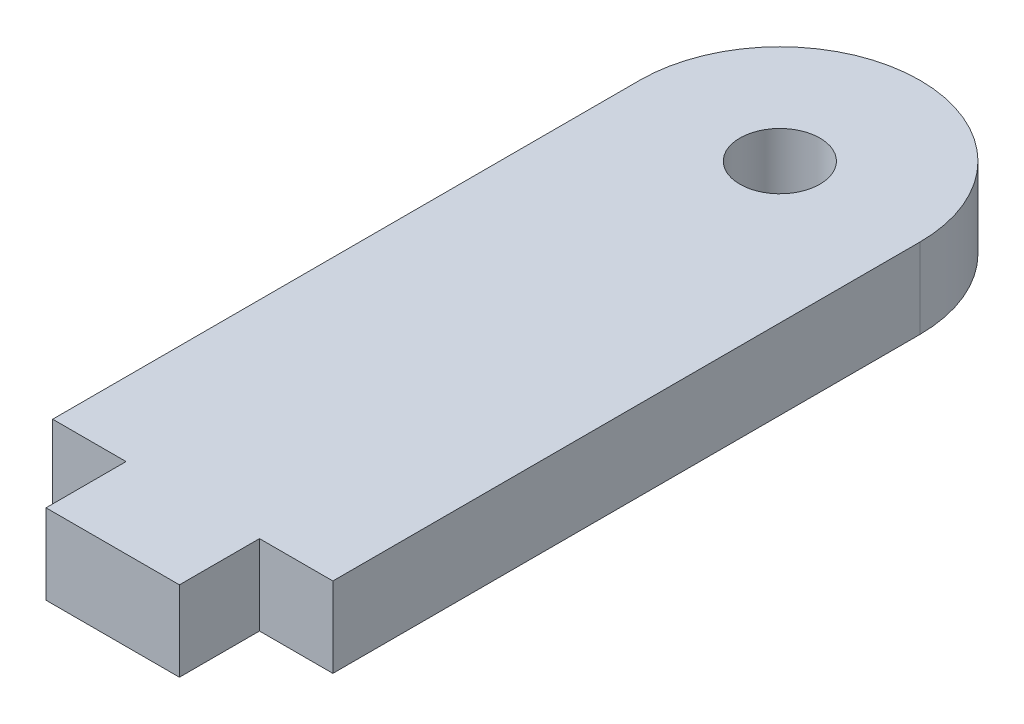
ISO-10303-21;
HEADER;
FILE_DESCRIPTION(('STEP AP214'),'2;1');
FILE_NAME('part.step','',(''),(''),'','','');
FILE_SCHEMA(('AUTOMOTIVE_DESIGN { 1 0 10303 214 1 1 1 1 }'));
ENDSEC;
DATA;
#1=APPLICATION_CONTEXT('core data for automotive mechanical design processes');
#2=APPLICATION_PROTOCOL_DEFINITION('international standard','automotive_design',2000,#1);
#3=PRODUCT_CONTEXT('',#1,'mechanical');
#4=PRODUCT('Part','Part','',(#3));
#5=PRODUCT_RELATED_PRODUCT_CATEGORY('part','',(#4));
#6=PRODUCT_DEFINITION_FORMATION('','',#4);
#7=PRODUCT_DEFINITION_CONTEXT('part definition',#1,'design');
#8=PRODUCT_DEFINITION('design','',#6,#7);
#9=PRODUCT_DEFINITION_SHAPE('','',#8);
#10=(LENGTH_UNIT() NAMED_UNIT(*) SI_UNIT(.MILLI.,.METRE.));
#11=(NAMED_UNIT(*) PLANE_ANGLE_UNIT() SI_UNIT($,.RADIAN.));
#12=(NAMED_UNIT(*) SI_UNIT($,.STERADIAN.) SOLID_ANGLE_UNIT());
#13=UNCERTAINTY_MEASURE_WITH_UNIT(LENGTH_MEASURE(1.E-05),#10,'distance_accuracy_value','');
#14=(GEOMETRIC_REPRESENTATION_CONTEXT(3) GLOBAL_UNCERTAINTY_ASSIGNED_CONTEXT((#13)) GLOBAL_UNIT_ASSIGNED_CONTEXT((#10,
#11,#12)) REPRESENTATION_CONTEXT('',''));
#15=CARTESIAN_POINT('',(0.,0.,0.));
#16=DIRECTION('',(0.,0.,1.));
#17=DIRECTION('',(1.,0.,0.));
#18=AXIS2_PLACEMENT_3D('',#15,#16,#17);
#19=CARTESIAN_POINT('',(10.5,3.,0.));
#20=DIRECTION('',(1.,0.,0.));
#21=DIRECTION('',(0.,0.,-1.));
#22=AXIS2_PLACEMENT_3D('',#19,#20,#21);
#23=PLANE('',#22);
#24=DIRECTION('',(0.,0.,1.));
#25=VECTOR('',#24,1.);
#26=CARTESIAN_POINT('',(10.5,0.,0.));
#27=LINE('',#26,#25);
#28=CARTESIAN_POINT('',(10.5,0.,0.));
#29=VERTEX_POINT('',#28);
#30=CARTESIAN_POINT('',(10.5,0.,22.));
#31=VERTEX_POINT('',#30);
#32=EDGE_CURVE('E149',#29,#31,#27,.T.);
#33=ORIENTED_EDGE('',*,*,#32,.F.);
#34=DIRECTION('',(0.,-1.,0.));
#35=VECTOR('',#34,1.);
#36=CARTESIAN_POINT('',(10.5,3.,0.));
#37=LINE('',#36,#35);
#38=CARTESIAN_POINT('',(10.5,3.,0.));
#39=VERTEX_POINT('',#38);
#40=EDGE_CURVE('E11',#39,#29,#37,.T.);
#41=ORIENTED_EDGE('',*,*,#40,.F.);
#42=DIRECTION('',(0.,0.,1.));
#43=VECTOR('',#42,1.);
#44=CARTESIAN_POINT('',(10.5,3.,0.));
#45=LINE('',#44,#43);
#46=CARTESIAN_POINT('',(10.5,3.,22.));
#47=VERTEX_POINT('',#46);
#48=EDGE_CURVE('E234',#39,#47,#45,.T.);
#49=ORIENTED_EDGE('',*,*,#48,.T.);
#50=DIRECTION('',(0.,-1.,0.));
#51=VECTOR('',#50,1.);
#52=CARTESIAN_POINT('',(10.5,3.,22.));
#53=LINE('',#52,#51);
#54=EDGE_CURVE('E97',#47,#31,#53,.T.);
#55=ORIENTED_EDGE('',*,*,#54,.T.);
#56=EDGE_LOOP('',(#33,#41,#49,#55));
#57=FACE_BOUND('',#56,.T.);
#58=ADVANCED_FACE('F45',(#57),#23,.T.);
#59=CARTESIAN_POINT('',(5.25,3.,0.));
#60=DIRECTION('',(0.,-1.,0.));
#61=DIRECTION('',(0.,0.,-1.));
#62=AXIS2_PLACEMENT_3D('',#59,#60,#61);
#63=CYLINDRICAL_SURFACE('',#62,5.25);
#64=CARTESIAN_POINT('',(5.25,0.,0.));
#65=DIRECTION('',(0.,1.,0.));
#66=DIRECTION('',(0.,0.,1.));
#67=AXIS2_PLACEMENT_3D('',#64,#65,#66);
#68=CIRCLE('',#67,5.25);
#69=CARTESIAN_POINT('',(0.,0.,0.));
#70=VERTEX_POINT('',#69);
#71=EDGE_CURVE('E153',#29,#70,#68,.T.);
#72=ORIENTED_EDGE('',*,*,#71,.T.);
#73=DIRECTION('',(0.,-1.,0.));
#74=VECTOR('',#73,1.);
#75=CARTESIAN_POINT('',(0.,3.,0.));
#76=LINE('',#75,#74);
#77=CARTESIAN_POINT('',(0.,3.,0.));
#78=VERTEX_POINT('',#77);
#79=EDGE_CURVE('E55',#78,#70,#76,.T.);
#80=ORIENTED_EDGE('',*,*,#79,.F.);
#81=CARTESIAN_POINT('',(5.25,3.,0.));
#82=DIRECTION('',(0.,1.,0.));
#83=DIRECTION('',(0.,0.,1.));
#84=AXIS2_PLACEMENT_3D('',#81,#82,#83);
#85=CIRCLE('',#84,5.25);
#86=EDGE_CURVE('E238',#39,#78,#85,.T.);
#87=ORIENTED_EDGE('',*,*,#86,.F.);
#88=ORIENTED_EDGE('',*,*,#40,.T.);
#89=EDGE_LOOP('',(#72,#80,#87,#88));
#90=FACE_BOUND('',#89,.T.);
#91=ADVANCED_FACE('F199',(#90),#63,.T.);
#92=CARTESIAN_POINT('',(0.,3.,0.));
#93=DIRECTION('',(1.,0.,0.));
#94=DIRECTION('',(0.,0.,-1.));
#95=AXIS2_PLACEMENT_3D('',#92,#93,#94);
#96=PLANE('',#95);
#97=DIRECTION('',(0.,0.,1.));
#98=VECTOR('',#97,1.);
#99=CARTESIAN_POINT('',(0.,0.,0.));
#100=LINE('',#99,#98);
#101=CARTESIAN_POINT('',(0.,0.,22.));
#102=VERTEX_POINT('',#101);
#103=EDGE_CURVE('E157',#70,#102,#100,.T.);
#104=ORIENTED_EDGE('',*,*,#103,.T.);
#105=DIRECTION('',(0.,-1.,0.));
#106=VECTOR('',#105,1.);
#107=CARTESIAN_POINT('',(0.,3.,22.));
#108=LINE('',#107,#106);
#109=CARTESIAN_POINT('',(0.,3.,22.));
#110=VERTEX_POINT('',#109);
#111=EDGE_CURVE('E185',#110,#102,#108,.T.);
#112=ORIENTED_EDGE('',*,*,#111,.F.);
#113=DIRECTION('',(0.,0.,1.));
#114=VECTOR('',#113,1.);
#115=CARTESIAN_POINT('',(0.,3.,0.));
#116=LINE('',#115,#114);
#117=EDGE_CURVE('E195',#78,#110,#116,.T.);
#118=ORIENTED_EDGE('',*,*,#117,.F.);
#119=ORIENTED_EDGE('',*,*,#79,.T.);
#120=EDGE_LOOP('',(#104,#112,#118,#119));
#121=FACE_BOUND('',#120,.T.);
#122=ADVANCED_FACE('F192',(#121),#96,.F.);
#123=CARTESIAN_POINT('',(0.,3.,22.));
#124=DIRECTION('',(0.,0.,-1.));
#125=DIRECTION('',(-1.,0.,0.));
#126=AXIS2_PLACEMENT_3D('',#123,#124,#125);
#127=PLANE('',#126);
#128=DIRECTION('',(1.,0.,0.));
#129=VECTOR('',#128,1.);
#130=CARTESIAN_POINT('',(0.,0.,22.));
#131=LINE('',#130,#129);
#132=CARTESIAN_POINT('',(2.75,0.,22.));
#133=VERTEX_POINT('',#132);
#134=EDGE_CURVE('E161',#102,#133,#131,.T.);
#135=ORIENTED_EDGE('',*,*,#134,.T.);
#136=DIRECTION('',(0.,-1.,0.));
#137=VECTOR('',#136,1.);
#138=CARTESIAN_POINT('',(2.75,3.,22.));
#139=LINE('',#138,#137);
#140=CARTESIAN_POINT('',(2.75,3.,22.));
#141=VERTEX_POINT('',#140);
#142=EDGE_CURVE('E181',#141,#133,#139,.T.);
#143=ORIENTED_EDGE('',*,*,#142,.F.);
#144=DIRECTION('',(1.,0.,0.));
#145=VECTOR('',#144,1.);
#146=CARTESIAN_POINT('',(0.,3.,22.));
#147=LINE('',#146,#145);
#148=EDGE_CURVE('E142',#110,#141,#147,.T.);
#149=ORIENTED_EDGE('',*,*,#148,.F.);
#150=ORIENTED_EDGE('',*,*,#111,.T.);
#151=EDGE_LOOP('',(#135,#143,#149,#150));
#152=FACE_BOUND('',#151,.T.);
#153=ADVANCED_FACE('F210',(#152),#127,.F.);
#154=CARTESIAN_POINT('',(2.75,3.,0.));
#155=DIRECTION('',(1.,0.,0.));
#156=DIRECTION('',(0.,0.,-1.));
#157=AXIS2_PLACEMENT_3D('',#154,#155,#156);
#158=PLANE('',#157);
#159=DIRECTION('',(0.,0.,1.));
#160=VECTOR('',#159,1.);
#161=CARTESIAN_POINT('',(2.75,0.,0.));
#162=LINE('',#161,#160);
#163=CARTESIAN_POINT('',(2.75,0.,25.));
#164=VERTEX_POINT('',#163);
#165=EDGE_CURVE('E165',#133,#164,#162,.T.);
#166=ORIENTED_EDGE('',*,*,#165,.T.);
#167=DIRECTION('',(0.,-1.,0.));
#168=VECTOR('',#167,1.);
#169=CARTESIAN_POINT('',(2.75,3.,25.));
#170=LINE('',#169,#168);
#171=CARTESIAN_POINT('',(2.75,3.,25.));
#172=VERTEX_POINT('',#171);
#173=EDGE_CURVE('E135',#172,#164,#170,.T.);
#174=ORIENTED_EDGE('',*,*,#173,.F.);
#175=DIRECTION('',(0.,0.,1.));
#176=VECTOR('',#175,1.);
#177=CARTESIAN_POINT('',(2.75,3.,0.));
#178=LINE('',#177,#176);
#179=EDGE_CURVE('E121',#141,#172,#178,.T.);
#180=ORIENTED_EDGE('',*,*,#179,.F.);
#181=ORIENTED_EDGE('',*,*,#142,.T.);
#182=EDGE_LOOP('',(#166,#174,#180,#181));
#183=FACE_BOUND('',#182,.T.);
#184=ADVANCED_FACE('F211',(#183),#158,.F.);
#185=CARTESIAN_POINT('',(0.,3.,25.));
#186=DIRECTION('',(0.,0.,-1.));
#187=DIRECTION('',(-1.,0.,0.));
#188=AXIS2_PLACEMENT_3D('',#185,#186,#187);
#189=PLANE('',#188);
#190=DIRECTION('',(1.,0.,0.));
#191=VECTOR('',#190,1.);
#192=CARTESIAN_POINT('',(0.,0.,25.));
#193=LINE('',#192,#191);
#194=CARTESIAN_POINT('',(7.75,0.,25.));
#195=VERTEX_POINT('',#194);
#196=EDGE_CURVE('E130',#164,#195,#193,.T.);
#197=ORIENTED_EDGE('',*,*,#196,.T.);
#198=DIRECTION('',(0.,-1.,0.));
#199=VECTOR('',#198,1.);
#200=CARTESIAN_POINT('',(7.75,3.,25.));
#201=LINE('',#200,#199);
#202=CARTESIAN_POINT('',(7.75,3.,25.));
#203=VERTEX_POINT('',#202);
#204=EDGE_CURVE('E128',#203,#195,#201,.T.);
#205=ORIENTED_EDGE('',*,*,#204,.F.);
#206=DIRECTION('',(1.,0.,0.));
#207=VECTOR('',#206,1.);
#208=CARTESIAN_POINT('',(0.,3.,25.));
#209=LINE('',#208,#207);
#210=EDGE_CURVE('E115',#172,#203,#209,.T.);
#211=ORIENTED_EDGE('',*,*,#210,.F.);
#212=ORIENTED_EDGE('',*,*,#173,.T.);
#213=EDGE_LOOP('',(#197,#205,#211,#212));
#214=FACE_BOUND('',#213,.T.);
#215=ADVANCED_FACE('F129',(#214),#189,.F.);
#216=CARTESIAN_POINT('',(7.75000000000001,3.,0.));
#217=DIRECTION('',(1.,0.,0.));
#218=DIRECTION('',(0.,0.,-1.));
#219=AXIS2_PLACEMENT_3D('',#216,#217,#218);
#220=PLANE('',#219);
#221=DIRECTION('',(0.,0.,1.));
#222=VECTOR('',#221,1.);
#223=CARTESIAN_POINT('',(7.75000000000001,0.,0.));
#224=LINE('',#223,#222);
#225=CARTESIAN_POINT('',(7.75,0.,22.));
#226=VERTEX_POINT('',#225);
#227=EDGE_CURVE('E172',#226,#195,#224,.T.);
#228=ORIENTED_EDGE('',*,*,#227,.F.);
#229=DIRECTION('',(0.,-1.,0.));
#230=VECTOR('',#229,1.);
#231=CARTESIAN_POINT('',(7.75,3.,22.));
#232=LINE('',#231,#230);
#233=CARTESIAN_POINT('',(7.75,3.,22.));
#234=VERTEX_POINT('',#233);
#235=EDGE_CURVE('E90',#234,#226,#232,.T.);
#236=ORIENTED_EDGE('',*,*,#235,.F.);
#237=DIRECTION('',(0.,0.,1.));
#238=VECTOR('',#237,1.);
#239=CARTESIAN_POINT('',(7.75000000000001,3.,0.));
#240=LINE('',#239,#238);
#241=EDGE_CURVE('E119',#234,#203,#240,.T.);
#242=ORIENTED_EDGE('',*,*,#241,.T.);
#243=ORIENTED_EDGE('',*,*,#204,.T.);
#244=EDGE_LOOP('',(#228,#236,#242,#243));
#245=FACE_BOUND('',#244,.T.);
#246=ADVANCED_FACE('F137',(#245),#220,.T.);
#247=CARTESIAN_POINT('',(5.25,3.,0.));
#248=DIRECTION('',(0.,-1.,0.));
#249=DIRECTION('',(0.,0.,-1.));
#250=AXIS2_PLACEMENT_3D('',#247,#248,#249);
#251=CYLINDRICAL_SURFACE('',#250,1.5);
#252=CARTESIAN_POINT('',(5.25,3.,0.));
#253=DIRECTION('',(0.,1.,0.));
#254=DIRECTION('',(0.,0.,1.));
#255=AXIS2_PLACEMENT_3D('',#252,#253,#254);
#256=CIRCLE('',#255,1.5);
#257=CARTESIAN_POINT('',(5.25,3.,1.5));
#258=VERTEX_POINT('',#257);
#259=EDGE_CURVE('E231',#258,#258,#256,.T.);
#260=ORIENTED_EDGE('',*,*,#259,.T.);
#261=EDGE_LOOP('',(#260));
#262=FACE_BOUND('',#261,.T.);
#263=CARTESIAN_POINT('',(5.25,0.,0.));
#264=DIRECTION('',(0.,1.,0.));
#265=DIRECTION('',(0.,0.,1.));
#266=AXIS2_PLACEMENT_3D('',#263,#264,#265);
#267=CIRCLE('',#266,1.5);
#268=CARTESIAN_POINT('',(5.25,0.,1.5));
#269=VERTEX_POINT('',#268);
#270=EDGE_CURVE('E145',#269,#269,#267,.T.);
#271=ORIENTED_EDGE('',*,*,#270,.F.);
#272=EDGE_LOOP('',(#271));
#273=FACE_BOUND('',#272,.T.);
#274=ADVANCED_FACE('F47',(#262,#273),#251,.F.);
#275=EDGE_CURVE('E166',#226,#31,#131,.T.);
#276=ORIENTED_EDGE('',*,*,#275,.T.);
#277=ORIENTED_EDGE('',*,*,#54,.F.);
#278=EDGE_CURVE('E63',#234,#47,#147,.T.);
#279=ORIENTED_EDGE('',*,*,#278,.F.);
#280=ORIENTED_EDGE('',*,*,#235,.T.);
#281=EDGE_LOOP('',(#276,#277,#279,#280));
#282=FACE_BOUND('',#281,.T.);
#283=ADVANCED_FACE('F219',(#282),#127,.F.);
#284=CARTESIAN_POINT('',(0.,3.,0.));
#285=DIRECTION('',(0.,1.,0.));
#286=DIRECTION('',(0.,0.,1.));
#287=AXIS2_PLACEMENT_3D('',#284,#285,#286);
#288=PLANE('',#287);
#289=ORIENTED_EDGE('',*,*,#259,.F.);
#290=EDGE_LOOP('',(#289));
#291=FACE_BOUND('',#290,.T.);
#292=ORIENTED_EDGE('',*,*,#48,.F.);
#293=ORIENTED_EDGE('',*,*,#86,.T.);
#294=ORIENTED_EDGE('',*,*,#117,.T.);
#295=ORIENTED_EDGE('',*,*,#148,.T.);
#296=ORIENTED_EDGE('',*,*,#179,.T.);
#297=ORIENTED_EDGE('',*,*,#210,.T.);
#298=ORIENTED_EDGE('',*,*,#241,.F.);
#299=ORIENTED_EDGE('',*,*,#278,.T.);
#300=EDGE_LOOP('',(#292,#293,#294,#295,#296,#297,#298,#299));
#301=FACE_BOUND('',#300,.T.);
#302=ADVANCED_FACE('F117',(#291,#301),#288,.T.);
#303=CARTESIAN_POINT('',(0.,0.,0.));
#304=DIRECTION('',(0.,1.,0.));
#305=DIRECTION('',(0.,0.,1.));
#306=AXIS2_PLACEMENT_3D('',#303,#304,#305);
#307=PLANE('',#306);
#308=ORIENTED_EDGE('',*,*,#270,.T.);
#309=EDGE_LOOP('',(#308));
#310=FACE_BOUND('',#309,.T.);
#311=ORIENTED_EDGE('',*,*,#32,.T.);
#312=ORIENTED_EDGE('',*,*,#275,.F.);
#313=ORIENTED_EDGE('',*,*,#227,.T.);
#314=ORIENTED_EDGE('',*,*,#196,.F.);
#315=ORIENTED_EDGE('',*,*,#165,.F.);
#316=ORIENTED_EDGE('',*,*,#134,.F.);
#317=ORIENTED_EDGE('',*,*,#103,.F.);
#318=ORIENTED_EDGE('',*,*,#71,.F.);
#319=EDGE_LOOP('',(#311,#312,#313,#314,#315,#316,#317,#318));
#320=FACE_BOUND('',#319,.T.);
#321=ADVANCED_FACE('F201',(#310,#320),#307,.F.);
#322=CLOSED_SHELL('',(#58,#91,#122,#153,#184,#215,#246,#274,#283,#302,#321));
#323=MANIFOLD_SOLID_BREP('B2',#322);
#324=ADVANCED_BREP_SHAPE_REPRESENTATION('',(#18,#323),#14);
#325=SHAPE_DEFINITION_REPRESENTATION(#9,#324);
ENDSEC;
END-ISO-10303-21;
